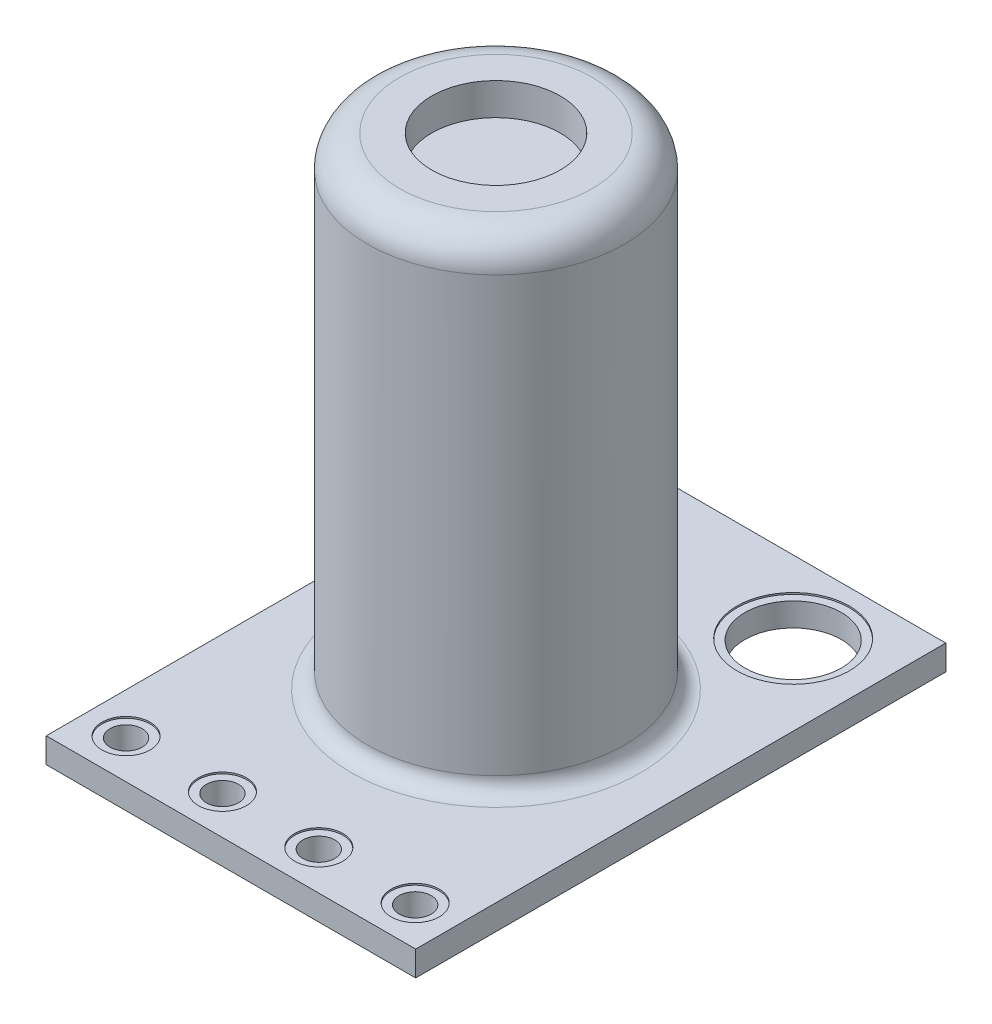
ISO-10303-21;
HEADER;
FILE_DESCRIPTION(('STEP AP214'),'2;1');
FILE_NAME('part.step','',(''),(''),'','','');
FILE_SCHEMA(('AUTOMOTIVE_DESIGN { 1 0 10303 214 1 1 1 1 }'));
ENDSEC;
DATA;
#1=APPLICATION_CONTEXT('core data for automotive mechanical design processes');
#2=APPLICATION_PROTOCOL_DEFINITION('international standard','automotive_design',2000,#1);
#3=PRODUCT_CONTEXT('',#1,'mechanical');
#4=PRODUCT('Part','Part','',(#3));
#5=PRODUCT_RELATED_PRODUCT_CATEGORY('part','',(#4));
#6=PRODUCT_DEFINITION_FORMATION('','',#4);
#7=PRODUCT_DEFINITION_CONTEXT('part definition',#1,'design');
#8=PRODUCT_DEFINITION('design','',#6,#7);
#9=PRODUCT_DEFINITION_SHAPE('','',#8);
#10=(LENGTH_UNIT() NAMED_UNIT(*) SI_UNIT(.MILLI.,.METRE.));
#11=(NAMED_UNIT(*) PLANE_ANGLE_UNIT() SI_UNIT($,.RADIAN.));
#12=(NAMED_UNIT(*) SI_UNIT($,.STERADIAN.) SOLID_ANGLE_UNIT());
#13=UNCERTAINTY_MEASURE_WITH_UNIT(LENGTH_MEASURE(1.E-05),#10,'distance_accuracy_value','');
#14=(GEOMETRIC_REPRESENTATION_CONTEXT(3) GLOBAL_UNCERTAINTY_ASSIGNED_CONTEXT((#13)) GLOBAL_UNIT_ASSIGNED_CONTEXT((#10,
#11,#12)) REPRESENTATION_CONTEXT('',''));
#15=CARTESIAN_POINT('',(0.,0.,0.));
#16=DIRECTION('',(0.,0.,1.));
#17=DIRECTION('',(1.,0.,0.));
#18=AXIS2_PLACEMENT_3D('',#15,#16,#17);
#19=CARTESIAN_POINT('',(-4.5,0.,7.01555949569887));
#20=DIRECTION('',(0.,1.,0.));
#21=DIRECTION('',(0.,0.,1.));
#22=AXIS2_PLACEMENT_3D('',#19,#20,#21);
#23=CYLINDRICAL_SURFACE('',#22,0.500000000000001);
#24=CARTESIAN_POINT('',(-4.5,0.,7.01555949569887));
#25=DIRECTION('',(0.,1.,0.));
#26=DIRECTION('',(0.,0.,1.));
#27=AXIS2_PLACEMENT_3D('',#24,#25,#26);
#28=CIRCLE('',#27,0.500000000000001);
#29=CARTESIAN_POINT('',(-4.5,0.,7.51555949569887));
#30=VERTEX_POINT('',#29);
#31=EDGE_CURVE('E134',#30,#30,#28,.T.);
#32=ORIENTED_EDGE('',*,*,#31,.F.);
#33=EDGE_LOOP('',(#32));
#34=FACE_BOUND('',#33,.T.);
#35=CARTESIAN_POINT('',(-4.5,0.73,7.01555949569887));
#36=DIRECTION('',(0.,1.,0.));
#37=DIRECTION('',(0.,0.,1.));
#38=AXIS2_PLACEMENT_3D('',#35,#36,#37);
#39=CIRCLE('',#38,0.500000000000001);
#40=CARTESIAN_POINT('',(-4.5,0.73,7.51555949569887));
#41=VERTEX_POINT('',#40);
#42=EDGE_CURVE('E268',#41,#41,#39,.T.);
#43=ORIENTED_EDGE('',*,*,#42,.T.);
#44=EDGE_LOOP('',(#43));
#45=FACE_BOUND('',#44,.T.);
#46=ADVANCED_FACE('F57',(#34,#45),#23,.F.);
#47=CARTESIAN_POINT('',(-1.5,0.,7.01555949569887));
#48=DIRECTION('',(0.,1.,0.));
#49=DIRECTION('',(0.,0.,1.));
#50=AXIS2_PLACEMENT_3D('',#47,#48,#49);
#51=CYLINDRICAL_SURFACE('',#50,0.5);
#52=CARTESIAN_POINT('',(-1.5,0.,7.01555949569887));
#53=DIRECTION('',(0.,1.,0.));
#54=DIRECTION('',(0.,0.,1.));
#55=AXIS2_PLACEMENT_3D('',#52,#53,#54);
#56=CIRCLE('',#55,0.5);
#57=CARTESIAN_POINT('',(-1.5,0.,7.51555949569887));
#58=VERTEX_POINT('',#57);
#59=EDGE_CURVE('E231',#58,#58,#56,.T.);
#60=ORIENTED_EDGE('',*,*,#59,.F.);
#61=EDGE_LOOP('',(#60));
#62=FACE_BOUND('',#61,.T.);
#63=CARTESIAN_POINT('',(-1.5,0.73,7.01555949569887));
#64=DIRECTION('',(0.,1.,0.));
#65=DIRECTION('',(0.,0.,1.));
#66=AXIS2_PLACEMENT_3D('',#63,#64,#65);
#67=CIRCLE('',#66,0.5);
#68=CARTESIAN_POINT('',(-1.5,0.73,7.51555949569887));
#69=VERTEX_POINT('',#68);
#70=EDGE_CURVE('E248',#69,#69,#67,.T.);
#71=ORIENTED_EDGE('',*,*,#70,.T.);
#72=EDGE_LOOP('',(#71));
#73=FACE_BOUND('',#72,.T.);
#74=ADVANCED_FACE('F176',(#62,#73),#51,.F.);
#75=CARTESIAN_POINT('',(-3.25,0.,-6.));
#76=DIRECTION('',(0.,1.,0.));
#77=DIRECTION('',(0.,0.,1.));
#78=AXIS2_PLACEMENT_3D('',#75,#76,#77);
#79=CYLINDRICAL_SURFACE('',#78,1.5);
#80=CARTESIAN_POINT('',(-3.25,0.,-6.));
#81=DIRECTION('',(0.,1.,0.));
#82=DIRECTION('',(0.,0.,1.));
#83=AXIS2_PLACEMENT_3D('',#80,#81,#82);
#84=CIRCLE('',#83,1.5);
#85=CARTESIAN_POINT('',(-3.25,0.,-4.5));
#86=VERTEX_POINT('',#85);
#87=EDGE_CURVE('E226',#86,#86,#84,.T.);
#88=CARTESIAN_POINT('',(-3.25,0.73,-6.));
#89=DIRECTION('',(0.,1.,0.));
#90=DIRECTION('',(0.,0.,1.));
#91=AXIS2_PLACEMENT_3D('',#88,#89,#90);
#92=CIRCLE('',#91,1.5);
#93=CARTESIAN_POINT('',(-3.25,0.73,-4.5));
#94=VERTEX_POINT('',#93);
#95=EDGE_CURVE('E324',#94,#94,#92,.T.);
#96=CARTESIAN_POINT('',(-3.25,0.,-4.5));
#97=CARTESIAN_POINT('',(-3.25,0.00760416666666665,-4.5));
#98=CARTESIAN_POINT('',(-3.25,0.0152083333333333,-4.5));
#99=CARTESIAN_POINT('',(-3.25,0.0304166666666667,-4.5));
#100=CARTESIAN_POINT('',(-3.25,0.0380208333333333,-4.5));
#101=CARTESIAN_POINT('',(-3.25,0.0532291666666667,-4.5));
#102=CARTESIAN_POINT('',(-3.25,0.0608333333333333,-4.5));
#103=CARTESIAN_POINT('',(-3.25,0.0760416666666667,-4.5));
#104=CARTESIAN_POINT('',(-3.25,0.0836458333333333,-4.5));
#105=CARTESIAN_POINT('',(-3.25,0.0988541666666666,-4.5));
#106=CARTESIAN_POINT('',(-3.25,0.106458333333333,-4.5));
#107=CARTESIAN_POINT('',(-3.25,0.121666666666667,-4.5));
#108=CARTESIAN_POINT('',(-3.25,0.129270833333333,-4.5));
#109=CARTESIAN_POINT('',(-3.25,0.144479166666667,-4.5));
#110=CARTESIAN_POINT('',(-3.25,0.152083333333333,-4.5));
#111=CARTESIAN_POINT('',(-3.25,0.167291666666667,-4.5));
#112=CARTESIAN_POINT('',(-3.25,0.174895833333333,-4.5));
#113=CARTESIAN_POINT('',(-3.25,0.190104166666667,-4.5));
#114=CARTESIAN_POINT('',(-3.25,0.197708333333333,-4.5));
#115=CARTESIAN_POINT('',(-3.25,0.212916666666667,-4.5));
#116=CARTESIAN_POINT('',(-3.25,0.220520833333333,-4.5));
#117=CARTESIAN_POINT('',(-3.25,0.235729166666667,-4.5));
#118=CARTESIAN_POINT('',(-3.25,0.243333333333333,-4.5));
#119=CARTESIAN_POINT('',(-3.25,0.258541666666667,-4.5));
#120=CARTESIAN_POINT('',(-3.25,0.266145833333333,-4.5));
#121=CARTESIAN_POINT('',(-3.25,0.281354166666667,-4.5));
#122=CARTESIAN_POINT('',(-3.25,0.288958333333333,-4.5));
#123=CARTESIAN_POINT('',(-3.25,0.304166666666667,-4.5));
#124=CARTESIAN_POINT('',(-3.25,0.311770833333333,-4.5));
#125=CARTESIAN_POINT('',(-3.25,0.326979166666667,-4.5));
#126=CARTESIAN_POINT('',(-3.25,0.334583333333333,-4.5));
#127=CARTESIAN_POINT('',(-3.25,0.349791666666667,-4.5));
#128=CARTESIAN_POINT('',(-3.25,0.357395833333333,-4.5));
#129=CARTESIAN_POINT('',(-3.25,0.372604166666667,-4.5));
#130=CARTESIAN_POINT('',(-3.25,0.380208333333333,-4.5));
#131=CARTESIAN_POINT('',(-3.25,0.395416666666667,-4.5));
#132=CARTESIAN_POINT('',(-3.25,0.403020833333333,-4.5));
#133=CARTESIAN_POINT('',(-3.25,0.418229166666667,-4.5));
#134=CARTESIAN_POINT('',(-3.25,0.425833333333333,-4.5));
#135=CARTESIAN_POINT('',(-3.25,0.441041666666667,-4.5));
#136=CARTESIAN_POINT('',(-3.25,0.448645833333333,-4.5));
#137=CARTESIAN_POINT('',(-3.25,0.463854166666667,-4.5));
#138=CARTESIAN_POINT('',(-3.25,0.471458333333333,-4.5));
#139=CARTESIAN_POINT('',(-3.25,0.486666666666667,-4.5));
#140=CARTESIAN_POINT('',(-3.25,0.494270833333333,-4.5));
#141=CARTESIAN_POINT('',(-3.25,0.509479166666667,-4.5));
#142=CARTESIAN_POINT('',(-3.25,0.517083333333333,-4.5));
#143=CARTESIAN_POINT('',(-3.25,0.532291666666667,-4.5));
#144=CARTESIAN_POINT('',(-3.25,0.539895833333333,-4.5));
#145=CARTESIAN_POINT('',(-3.25,0.555104166666667,-4.5));
#146=CARTESIAN_POINT('',(-3.25,0.562708333333333,-4.5));
#147=CARTESIAN_POINT('',(-3.25,0.577916666666667,-4.5));
#148=CARTESIAN_POINT('',(-3.25,0.585520833333333,-4.5));
#149=CARTESIAN_POINT('',(-3.25,0.600729166666667,-4.5));
#150=CARTESIAN_POINT('',(-3.25,0.608333333333333,-4.5));
#151=CARTESIAN_POINT('',(-3.25,0.623541666666667,-4.5));
#152=CARTESIAN_POINT('',(-3.25,0.631145833333333,-4.5));
#153=CARTESIAN_POINT('',(-3.25,0.646354166666666,-4.5));
#154=CARTESIAN_POINT('',(-3.25,0.653958333333333,-4.5));
#155=CARTESIAN_POINT('',(-3.25,0.669166666666667,-4.5));
#156=CARTESIAN_POINT('',(-3.25,0.676770833333333,-4.5));
#157=CARTESIAN_POINT('',(-3.25,0.691979166666666,-4.5));
#158=CARTESIAN_POINT('',(-3.25,0.699583333333333,-4.5));
#159=CARTESIAN_POINT('',(-3.25,0.714791666666666,-4.5));
#160=CARTESIAN_POINT('',(-3.25,0.722395833333333,-4.5));
#161=CARTESIAN_POINT('',(-3.25,0.73,-4.5));
#162=B_SPLINE_CURVE_WITH_KNOTS('',3,(#96,#97,#98,#99,#100,#101,#102,#103,#104,#105,#106,#107,
#108,#109,#110,#111,#112,#113,#114,#115,#116,#117,#118,#119,#120,#121,#122,#123,#124,#125,#126,
#127,#128,#129,#130,#131,#132,#133,#134,#135,#136,#137,#138,#139,#140,#141,#142,#143,#144,#145,
#146,#147,#148,#149,#150,#151,#152,#153,#154,#155,#156,#157,#158,#159,#160,#161),.UNSPECIFIED.,
.F.,.F.,(4,2,2,2,2,2,2,2,2,2,2,2,2,2,2,2,2,2,2,2,2,2,2,2,2,2,2,2,2,2,2,2,4),(0.,0.0228125,
0.045625,0.0684375,0.09125,0.1140625,0.136875,0.1596875,0.1825,0.2053125,0.228125,0.2509375,
0.27375,0.2965625,0.319375,0.3421875,0.365,0.3878125,0.410625,0.4334375,0.45625,0.4790625,
0.501875,0.5246875,0.5475,0.5703125,0.593125,0.6159375,0.63875,0.6615625,0.684375,0.7071875,
0.73),.UNSPECIFIED.);
#163=EDGE_CURVE('BSEAM183',#86,#94,#162,.T.);
#164=ORIENTED_EDGE('',*,*,#87,.F.);
#165=ORIENTED_EDGE('',*,*,#95,.T.);
#166=ORIENTED_EDGE('',*,*,#163,.T.);
#167=ORIENTED_EDGE('',*,*,#163,.F.);
#168=EDGE_LOOP('',(#164,#166,#165,#167));
#169=FACE_BOUND('',#168,.T.);
#170=ADVANCED_FACE('F183',(#169),#79,.F.);
#171=CARTESIAN_POINT('',(0.,0.78,0.));
#172=DIRECTION('',(0.,-1.,0.));
#173=DIRECTION('',(0.,0.,-1.));
#174=AXIS2_PLACEMENT_3D('',#171,#172,#173);
#175=PLANE('',#174);
#176=CARTESIAN_POINT('',(0.,0.78,0.));
#177=DIRECTION('',(0.,-1.,0.));
#178=DIRECTION('',(0.,0.,-1.));
#179=AXIS2_PLACEMENT_3D('',#176,#177,#178);
#180=CIRCLE('',#179,4.5);
#181=CARTESIAN_POINT('',(0.,0.78,-4.5));
#182=VERTEX_POINT('',#181);
#183=EDGE_CURVE('E12',#182,#182,#180,.T.);
#184=ORIENTED_EDGE('',*,*,#183,.T.);
#185=EDGE_LOOP('',(#184));
#186=FACE_BOUND('',#185,.T.);
#187=CARTESIAN_POINT('',(-3.25,0.78,-6.));
#188=DIRECTION('',(0.,1.,0.));
#189=DIRECTION('',(0.,0.,1.));
#190=AXIS2_PLACEMENT_3D('',#187,#188,#189);
#191=CIRCLE('',#190,1.75);
#192=CARTESIAN_POINT('',(-3.25,0.78,-4.25));
#193=VERTEX_POINT('',#192);
#194=EDGE_CURVE('E264',#193,#193,#191,.T.);
#195=ORIENTED_EDGE('',*,*,#194,.F.);
#196=EDGE_LOOP('',(#195));
#197=FACE_BOUND('',#196,.T.);
#198=CARTESIAN_POINT('',(1.5,0.78,7.01555949569887));
#199=DIRECTION('',(0.,1.,0.));
#200=DIRECTION('',(0.,0.,-1.));
#201=AXIS2_PLACEMENT_3D('',#198,#199,#200);
#202=CIRCLE('',#201,0.75);
#203=CARTESIAN_POINT('',(1.5,0.78,6.26555949569887));
#204=VERTEX_POINT('',#203);
#205=EDGE_CURVE('E337',#204,#204,#202,.T.);
#206=ORIENTED_EDGE('',*,*,#205,.F.);
#207=EDGE_LOOP('',(#206));
#208=FACE_BOUND('',#207,.T.);
#209=CARTESIAN_POINT('',(4.5,0.78,7.01555949569887));
#210=DIRECTION('',(0.,1.,0.));
#211=DIRECTION('',(0.,0.,-1.));
#212=AXIS2_PLACEMENT_3D('',#209,#210,#211);
#213=CIRCLE('',#212,0.75);
#214=CARTESIAN_POINT('',(4.5,0.78,6.26555949569887));
#215=VERTEX_POINT('',#214);
#216=EDGE_CURVE('E260',#215,#215,#213,.T.);
#217=ORIENTED_EDGE('',*,*,#216,.F.);
#218=EDGE_LOOP('',(#217));
#219=FACE_BOUND('',#218,.T.);
#220=CARTESIAN_POINT('',(-1.5,0.78,7.01555949569887));
#221=DIRECTION('',(0.,1.,0.));
#222=DIRECTION('',(0.,0.,1.));
#223=AXIS2_PLACEMENT_3D('',#220,#221,#222);
#224=CIRCLE('',#223,0.75);
#225=CARTESIAN_POINT('',(-1.5,0.78,7.76555949569887));
#226=VERTEX_POINT('',#225);
#227=EDGE_CURVE('E251',#226,#226,#224,.T.);
#228=ORIENTED_EDGE('',*,*,#227,.F.);
#229=EDGE_LOOP('',(#228));
#230=FACE_BOUND('',#229,.T.);
#231=CARTESIAN_POINT('',(3.25,0.78,-6.));
#232=DIRECTION('',(0.,1.,0.));
#233=DIRECTION('',(0.,0.,-1.));
#234=AXIS2_PLACEMENT_3D('',#231,#232,#233);
#235=CIRCLE('',#234,1.75);
#236=CARTESIAN_POINT('',(3.25,0.78,-7.75000000000001));
#237=VERTEX_POINT('',#236);
#238=EDGE_CURVE('E334',#237,#237,#235,.T.);
#239=ORIENTED_EDGE('',*,*,#238,.F.);
#240=EDGE_LOOP('',(#239));
#241=FACE_BOUND('',#240,.T.);
#242=CARTESIAN_POINT('',(-4.5,0.78,7.01555949569887));
#243=DIRECTION('',(0.,1.,0.));
#244=DIRECTION('',(0.,0.,1.));
#245=AXIS2_PLACEMENT_3D('',#242,#243,#244);
#246=CIRCLE('',#245,0.75);
#247=CARTESIAN_POINT('',(-4.5,0.78,7.76555949569887));
#248=VERTEX_POINT('',#247);
#249=EDGE_CURVE('E281',#248,#248,#246,.T.);
#250=ORIENTED_EDGE('',*,*,#249,.F.);
#251=EDGE_LOOP('',(#250));
#252=FACE_BOUND('',#251,.T.);
#253=DIRECTION('',(0.,0.,-1.));
#254=VECTOR('',#253,1.);
#255=CARTESIAN_POINT('',(5.75,0.78,8.25));
#256=LINE('',#255,#254);
#257=CARTESIAN_POINT('',(5.75,0.78,8.25));
#258=VERTEX_POINT('',#257);
#259=CARTESIAN_POINT('',(5.75,0.78,-8.25));
#260=VERTEX_POINT('',#259);
#261=EDGE_CURVE('E111',#258,#260,#256,.T.);
#262=ORIENTED_EDGE('',*,*,#261,.T.);
#263=DIRECTION('',(-1.,0.,0.));
#264=VECTOR('',#263,1.);
#265=CARTESIAN_POINT('',(-5.75,0.78,-8.25));
#266=LINE('',#265,#264);
#267=CARTESIAN_POINT('',(-5.75,0.78,-8.25));
#268=VERTEX_POINT('',#267);
#269=EDGE_CURVE('E106',#260,#268,#266,.T.);
#270=ORIENTED_EDGE('',*,*,#269,.T.);
#271=DIRECTION('',(0.,0.,1.));
#272=VECTOR('',#271,1.);
#273=CARTESIAN_POINT('',(-5.75,0.78,8.25));
#274=LINE('',#273,#272);
#275=CARTESIAN_POINT('',(-5.75,0.78,8.25));
#276=VERTEX_POINT('',#275);
#277=EDGE_CURVE('E109',#268,#276,#274,.T.);
#278=ORIENTED_EDGE('',*,*,#277,.T.);
#279=DIRECTION('',(1.,0.,0.));
#280=VECTOR('',#279,1.);
#281=CARTESIAN_POINT('',(-5.75,0.78,8.25));
#282=LINE('',#281,#280);
#283=EDGE_CURVE('E75',#276,#258,#282,.T.);
#284=ORIENTED_EDGE('',*,*,#283,.T.);
#285=EDGE_LOOP('',(#262,#270,#278,#284));
#286=FACE_BOUND('',#285,.T.);
#287=ADVANCED_FACE('F107',(#186,#197,#208,#219,#230,#241,#252,#286),#175,.F.);
#288=CARTESIAN_POINT('',(0.,0.,0.));
#289=DIRECTION('',(0.,-1.,0.));
#290=DIRECTION('',(0.,0.,-1.));
#291=AXIS2_PLACEMENT_3D('',#288,#289,#290);
#292=PLANE('',#291);
#293=ORIENTED_EDGE('',*,*,#87,.T.);
#294=EDGE_LOOP('',(#293));
#295=FACE_BOUND('',#294,.T.);
#296=CARTESIAN_POINT('',(1.5,0.,7.01555949569887));
#297=DIRECTION('',(0.,1.,0.));
#298=DIRECTION('',(0.,0.,1.));
#299=AXIS2_PLACEMENT_3D('',#296,#297,#298);
#300=CIRCLE('',#299,0.5);
#301=CARTESIAN_POINT('',(1.5,0.,7.51555949569887));
#302=VERTEX_POINT('',#301);
#303=EDGE_CURVE('E225',#302,#302,#300,.F.);
#304=ORIENTED_EDGE('',*,*,#303,.F.);
#305=EDGE_LOOP('',(#304));
#306=FACE_BOUND('',#305,.T.);
#307=ORIENTED_EDGE('',*,*,#59,.T.);
#308=EDGE_LOOP('',(#307));
#309=FACE_BOUND('',#308,.T.);
#310=DIRECTION('',(0.,0.,-1.));
#311=VECTOR('',#310,1.);
#312=CARTESIAN_POINT('',(5.75,0.,8.25));
#313=LINE('',#312,#311);
#314=CARTESIAN_POINT('',(5.75,0.,8.25));
#315=VERTEX_POINT('',#314);
#316=CARTESIAN_POINT('',(5.75,0.,-8.25));
#317=VERTEX_POINT('',#316);
#318=EDGE_CURVE('E130',#315,#317,#313,.T.);
#319=ORIENTED_EDGE('',*,*,#318,.F.);
#320=DIRECTION('',(1.,0.,0.));
#321=VECTOR('',#320,1.);
#322=CARTESIAN_POINT('',(-5.75,0.,8.25));
#323=LINE('',#322,#321);
#324=CARTESIAN_POINT('',(-5.75,0.,8.25));
#325=VERTEX_POINT('',#324);
#326=EDGE_CURVE('E98',#325,#315,#323,.T.);
#327=ORIENTED_EDGE('',*,*,#326,.F.);
#328=DIRECTION('',(0.,0.,1.));
#329=VECTOR('',#328,1.);
#330=CARTESIAN_POINT('',(-5.75,0.,8.25));
#331=LINE('',#330,#329);
#332=CARTESIAN_POINT('',(-5.75,0.,-8.25));
#333=VERTEX_POINT('',#332);
#334=EDGE_CURVE('E92',#333,#325,#331,.T.);
#335=ORIENTED_EDGE('',*,*,#334,.F.);
#336=DIRECTION('',(-1.,0.,0.));
#337=VECTOR('',#336,1.);
#338=CARTESIAN_POINT('',(-5.75,0.,-8.25));
#339=LINE('',#338,#337);
#340=EDGE_CURVE('E117',#317,#333,#339,.T.);
#341=ORIENTED_EDGE('',*,*,#340,.F.);
#342=EDGE_LOOP('',(#319,#327,#335,#341));
#343=FACE_BOUND('',#342,.T.);
#344=ORIENTED_EDGE('',*,*,#31,.T.);
#345=EDGE_LOOP('',(#344));
#346=FACE_BOUND('',#345,.T.);
#347=CARTESIAN_POINT('',(3.25,0.,-6.));
#348=DIRECTION('',(0.,1.,0.));
#349=DIRECTION('',(0.,0.,1.));
#350=AXIS2_PLACEMENT_3D('',#347,#348,#349);
#351=CIRCLE('',#350,1.5);
#352=CARTESIAN_POINT('',(3.25,0.,-4.5));
#353=VERTEX_POINT('',#352);
#354=EDGE_CURVE('E219',#353,#353,#351,.F.);
#355=ORIENTED_EDGE('',*,*,#354,.F.);
#356=EDGE_LOOP('',(#355));
#357=FACE_BOUND('',#356,.T.);
#358=CARTESIAN_POINT('',(4.5,0.,7.01555949569887));
#359=DIRECTION('',(0.,1.,0.));
#360=DIRECTION('',(0.,0.,1.));
#361=AXIS2_PLACEMENT_3D('',#358,#359,#360);
#362=CIRCLE('',#361,0.500000000000001);
#363=CARTESIAN_POINT('',(4.5,0.,7.51555949569887));
#364=VERTEX_POINT('',#363);
#365=EDGE_CURVE('E222',#364,#364,#362,.F.);
#366=ORIENTED_EDGE('',*,*,#365,.F.);
#367=EDGE_LOOP('',(#366));
#368=FACE_BOUND('',#367,.T.);
#369=ADVANCED_FACE('F193',(#295,#306,#309,#343,#346,#357,#368),#292,.T.);
#370=CARTESIAN_POINT('',(5.75,0.78,8.25));
#371=DIRECTION('',(-1.,0.,0.));
#372=DIRECTION('',(0.,0.,1.));
#373=AXIS2_PLACEMENT_3D('',#370,#371,#372);
#374=PLANE('',#373);
#375=ORIENTED_EDGE('',*,*,#318,.T.);
#376=DIRECTION('',(0.,-1.,0.));
#377=VECTOR('',#376,1.);
#378=CARTESIAN_POINT('',(5.75,0.78,-8.25));
#379=LINE('',#378,#377);
#380=EDGE_CURVE('E119',#260,#317,#379,.T.);
#381=ORIENTED_EDGE('',*,*,#380,.F.);
#382=ORIENTED_EDGE('',*,*,#261,.F.);
#383=DIRECTION('',(0.,-1.,0.));
#384=VECTOR('',#383,1.);
#385=CARTESIAN_POINT('',(5.75,0.78,8.25));
#386=LINE('',#385,#384);
#387=EDGE_CURVE('E126',#258,#315,#386,.T.);
#388=ORIENTED_EDGE('',*,*,#387,.T.);
#389=EDGE_LOOP('',(#375,#381,#382,#388));
#390=FACE_BOUND('',#389,.T.);
#391=ADVANCED_FACE('F197',(#390),#374,.F.);
#392=CARTESIAN_POINT('',(-5.75,0.78,-8.25));
#393=DIRECTION('',(0.,0.,1.));
#394=DIRECTION('',(1.,0.,0.));
#395=AXIS2_PLACEMENT_3D('',#392,#393,#394);
#396=PLANE('',#395);
#397=ORIENTED_EDGE('',*,*,#340,.T.);
#398=DIRECTION('',(0.,-1.,0.));
#399=VECTOR('',#398,1.);
#400=CARTESIAN_POINT('',(-5.75,0.78,-8.25));
#401=LINE('',#400,#399);
#402=EDGE_CURVE('E115',#268,#333,#401,.T.);
#403=ORIENTED_EDGE('',*,*,#402,.F.);
#404=ORIENTED_EDGE('',*,*,#269,.F.);
#405=ORIENTED_EDGE('',*,*,#380,.T.);
#406=EDGE_LOOP('',(#397,#403,#404,#405));
#407=FACE_BOUND('',#406,.T.);
#408=ADVANCED_FACE('F116',(#407),#396,.F.);
#409=CARTESIAN_POINT('',(-5.75,0.78,8.25));
#410=DIRECTION('',(1.,0.,0.));
#411=DIRECTION('',(0.,0.,-1.));
#412=AXIS2_PLACEMENT_3D('',#409,#410,#411);
#413=PLANE('',#412);
#414=ORIENTED_EDGE('',*,*,#334,.T.);
#415=DIRECTION('',(0.,-1.,0.));
#416=VECTOR('',#415,1.);
#417=CARTESIAN_POINT('',(-5.75,0.78,8.25));
#418=LINE('',#417,#416);
#419=EDGE_CURVE('E120',#276,#325,#418,.T.);
#420=ORIENTED_EDGE('',*,*,#419,.F.);
#421=ORIENTED_EDGE('',*,*,#277,.F.);
#422=ORIENTED_EDGE('',*,*,#402,.T.);
#423=EDGE_LOOP('',(#414,#420,#421,#422));
#424=FACE_BOUND('',#423,.T.);
#425=ADVANCED_FACE('F122',(#424),#413,.F.);
#426=CARTESIAN_POINT('',(-5.75,0.78,8.25));
#427=DIRECTION('',(0.,0.,-1.));
#428=DIRECTION('',(-1.,0.,0.));
#429=AXIS2_PLACEMENT_3D('',#426,#427,#428);
#430=PLANE('',#429);
#431=ORIENTED_EDGE('',*,*,#326,.T.);
#432=ORIENTED_EDGE('',*,*,#387,.F.);
#433=ORIENTED_EDGE('',*,*,#283,.F.);
#434=ORIENTED_EDGE('',*,*,#419,.T.);
#435=EDGE_LOOP('',(#431,#432,#433,#434));
#436=FACE_BOUND('',#435,.T.);
#437=ADVANCED_FACE('F199',(#436),#430,.F.);
#438=CARTESIAN_POINT('',(3.25,0.,-6.));
#439=DIRECTION('',(0.,1.,0.));
#440=DIRECTION('',(0.,0.,1.));
#441=AXIS2_PLACEMENT_3D('',#438,#439,#440);
#442=CYLINDRICAL_SURFACE('',#441,1.5);
#443=CARTESIAN_POINT('',(3.25,0.73,-6.));
#444=DIRECTION('',(0.,1.,0.));
#445=DIRECTION('',(0.,0.,-1.));
#446=AXIS2_PLACEMENT_3D('',#443,#444,#445);
#447=CIRCLE('',#446,1.5);
#448=CARTESIAN_POINT('',(3.25,0.73,-4.5));
#449=VERTEX_POINT('',#448);
#450=EDGE_CURVE('E374',#449,#449,#447,.T.);
#451=CARTESIAN_POINT('',(3.25,0.73,-4.5));
#452=CARTESIAN_POINT('',(3.25,0.722395833333333,-4.5));
#453=CARTESIAN_POINT('',(3.25,0.714791666666666,-4.5));
#454=CARTESIAN_POINT('',(3.25,0.699583333333333,-4.5));
#455=CARTESIAN_POINT('',(3.25,0.691979166666666,-4.5));
#456=CARTESIAN_POINT('',(3.25,0.676770833333333,-4.5));
#457=CARTESIAN_POINT('',(3.25,0.669166666666667,-4.5));
#458=CARTESIAN_POINT('',(3.25,0.653958333333333,-4.5));
#459=CARTESIAN_POINT('',(3.25,0.646354166666666,-4.5));
#460=CARTESIAN_POINT('',(3.25,0.631145833333333,-4.5));
#461=CARTESIAN_POINT('',(3.25,0.623541666666667,-4.5));
#462=CARTESIAN_POINT('',(3.25,0.608333333333333,-4.5));
#463=CARTESIAN_POINT('',(3.25,0.600729166666667,-4.5));
#464=CARTESIAN_POINT('',(3.25,0.585520833333333,-4.5));
#465=CARTESIAN_POINT('',(3.25,0.577916666666666,-4.5));
#466=CARTESIAN_POINT('',(3.25,0.562708333333333,-4.5));
#467=CARTESIAN_POINT('',(3.25,0.555104166666667,-4.5));
#468=CARTESIAN_POINT('',(3.25,0.539895833333333,-4.5));
#469=CARTESIAN_POINT('',(3.25,0.532291666666667,-4.5));
#470=CARTESIAN_POINT('',(3.25,0.517083333333333,-4.5));
#471=CARTESIAN_POINT('',(3.25,0.509479166666667,-4.5));
#472=CARTESIAN_POINT('',(3.25,0.494270833333333,-4.5));
#473=CARTESIAN_POINT('',(3.25,0.486666666666667,-4.5));
#474=CARTESIAN_POINT('',(3.25,0.471458333333333,-4.5));
#475=CARTESIAN_POINT('',(3.25,0.463854166666667,-4.5));
#476=CARTESIAN_POINT('',(3.25,0.448645833333333,-4.5));
#477=CARTESIAN_POINT('',(3.25,0.441041666666667,-4.5));
#478=CARTESIAN_POINT('',(3.25,0.425833333333333,-4.5));
#479=CARTESIAN_POINT('',(3.25,0.418229166666667,-4.5));
#480=CARTESIAN_POINT('',(3.25,0.403020833333333,-4.5));
#481=CARTESIAN_POINT('',(3.25,0.395416666666667,-4.5));
#482=CARTESIAN_POINT('',(3.25,0.380208333333333,-4.5));
#483=CARTESIAN_POINT('',(3.25,0.372604166666667,-4.5));
#484=CARTESIAN_POINT('',(3.25,0.357395833333333,-4.5));
#485=CARTESIAN_POINT('',(3.25,0.349791666666667,-4.5));
#486=CARTESIAN_POINT('',(3.25,0.334583333333333,-4.5));
#487=CARTESIAN_POINT('',(3.25,0.326979166666667,-4.5));
#488=CARTESIAN_POINT('',(3.25,0.311770833333333,-4.5));
#489=CARTESIAN_POINT('',(3.25,0.304166666666667,-4.5));
#490=CARTESIAN_POINT('',(3.25,0.288958333333333,-4.5));
#491=CARTESIAN_POINT('',(3.25,0.281354166666667,-4.5));
#492=CARTESIAN_POINT('',(3.25,0.266145833333333,-4.5));
#493=CARTESIAN_POINT('',(3.25,0.258541666666667,-4.5));
#494=CARTESIAN_POINT('',(3.25,0.243333333333333,-4.5));
#495=CARTESIAN_POINT('',(3.25,0.235729166666667,-4.5));
#496=CARTESIAN_POINT('',(3.25,0.220520833333333,-4.5));
#497=CARTESIAN_POINT('',(3.25,0.212916666666667,-4.5));
#498=CARTESIAN_POINT('',(3.25,0.197708333333333,-4.5));
#499=CARTESIAN_POINT('',(3.25,0.190104166666667,-4.5));
#500=CARTESIAN_POINT('',(3.25,0.174895833333333,-4.5));
#501=CARTESIAN_POINT('',(3.25,0.167291666666667,-4.5));
#502=CARTESIAN_POINT('',(3.25,0.152083333333333,-4.5));
#503=CARTESIAN_POINT('',(3.25,0.144479166666667,-4.5));
#504=CARTESIAN_POINT('',(3.25,0.129270833333333,-4.5));
#505=CARTESIAN_POINT('',(3.25,0.121666666666667,-4.5));
#506=CARTESIAN_POINT('',(3.25,0.106458333333333,-4.5));
#507=CARTESIAN_POINT('',(3.25,0.0988541666666666,-4.5));
#508=CARTESIAN_POINT('',(3.25,0.0836458333333333,-4.5));
#509=CARTESIAN_POINT('',(3.25,0.0760416666666667,-4.5));
#510=CARTESIAN_POINT('',(3.25,0.0608333333333333,-4.5));
#511=CARTESIAN_POINT('',(3.25,0.0532291666666667,-4.5));
#512=CARTESIAN_POINT('',(3.25,0.0380208333333333,-4.5));
#513=CARTESIAN_POINT('',(3.25,0.0304166666666667,-4.5));
#514=CARTESIAN_POINT('',(3.25,0.0152083333333334,-4.5));
#515=CARTESIAN_POINT('',(3.25,0.00760416666666669,-4.5));
#516=CARTESIAN_POINT('',(3.25,0.,-4.5));
#517=B_SPLINE_CURVE_WITH_KNOTS('',3,(#451,#452,#453,#454,#455,#456,#457,#458,#459,#460,#461,
#462,#463,#464,#465,#466,#467,#468,#469,#470,#471,#472,#473,#474,#475,#476,#477,#478,#479,#480,
#481,#482,#483,#484,#485,#486,#487,#488,#489,#490,#491,#492,#493,#494,#495,#496,#497,#498,#499,
#500,#501,#502,#503,#504,#505,#506,#507,#508,#509,#510,#511,#512,#513,#514,#515,#516),
.UNSPECIFIED.,.F.,.F.,(4,2,2,2,2,2,2,2,2,2,2,2,2,2,2,2,2,2,2,2,2,2,2,2,2,2,2,2,2,2,2,2,4),(0.,
0.0228125,0.045625,0.0684375,0.09125,0.1140625,0.136875,0.1596875,0.1825,0.2053125,0.228125,
0.2509375,0.27375,0.2965625,0.319375,0.3421875,0.365,0.3878125,0.410625,0.4334375,0.45625,
0.4790625,0.501875,0.5246875,0.5475,0.5703125,0.593125,0.6159375,0.63875,0.6615625,0.684375,
0.7071875,0.73),.UNSPECIFIED.);
#518=EDGE_CURVE('BSEAM202',#449,#353,#517,.T.);
#519=ORIENTED_EDGE('',*,*,#450,.T.);
#520=ORIENTED_EDGE('',*,*,#354,.T.);
#521=ORIENTED_EDGE('',*,*,#518,.T.);
#522=ORIENTED_EDGE('',*,*,#518,.F.);
#523=EDGE_LOOP('',(#519,#521,#520,#522));
#524=FACE_BOUND('',#523,.T.);
#525=ADVANCED_FACE('F202',(#524),#442,.F.);
#526=CARTESIAN_POINT('',(1.5,0.,7.01555949569887));
#527=DIRECTION('',(0.,1.,0.));
#528=DIRECTION('',(0.,0.,1.));
#529=AXIS2_PLACEMENT_3D('',#526,#527,#528);
#530=CYLINDRICAL_SURFACE('',#529,0.5);
#531=CARTESIAN_POINT('',(1.5,0.73,7.01555949569887));
#532=DIRECTION('',(0.,1.,0.));
#533=DIRECTION('',(0.,0.,-1.));
#534=AXIS2_PLACEMENT_3D('',#531,#532,#533);
#535=CIRCLE('',#534,0.5);
#536=CARTESIAN_POINT('',(1.5,0.73,6.51555949569887));
#537=VERTEX_POINT('',#536);
#538=EDGE_CURVE('E341',#537,#537,#535,.T.);
#539=ORIENTED_EDGE('',*,*,#538,.T.);
#540=EDGE_LOOP('',(#539));
#541=FACE_BOUND('',#540,.T.);
#542=ORIENTED_EDGE('',*,*,#303,.T.);
#543=EDGE_LOOP('',(#542));
#544=FACE_BOUND('',#543,.T.);
#545=ADVANCED_FACE('F190',(#541,#544),#530,.F.);
#546=CARTESIAN_POINT('',(4.5,0.,7.01555949569887));
#547=DIRECTION('',(0.,1.,0.));
#548=DIRECTION('',(0.,0.,1.));
#549=AXIS2_PLACEMENT_3D('',#546,#547,#548);
#550=CYLINDRICAL_SURFACE('',#549,0.500000000000001);
#551=CARTESIAN_POINT('',(4.5,0.73,7.01555949569887));
#552=DIRECTION('',(0.,1.,0.));
#553=DIRECTION('',(0.,0.,-1.));
#554=AXIS2_PLACEMENT_3D('',#551,#552,#553);
#555=CIRCLE('',#554,0.500000000000001);
#556=CARTESIAN_POINT('',(4.5,0.73,6.51555949569887));
#557=VERTEX_POINT('',#556);
#558=EDGE_CURVE('E270',#557,#557,#555,.T.);
#559=ORIENTED_EDGE('',*,*,#558,.T.);
#560=EDGE_LOOP('',(#559));
#561=FACE_BOUND('',#560,.T.);
#562=ORIENTED_EDGE('',*,*,#365,.T.);
#563=EDGE_LOOP('',(#562));
#564=FACE_BOUND('',#563,.T.);
#565=ADVANCED_FACE('F311',(#561,#564),#550,.F.);
#566=CARTESIAN_POINT('',(-3.25,0.73,-6.));
#567=DIRECTION('',(0.,1.,0.));
#568=DIRECTION('',(0.,0.,1.));
#569=AXIS2_PLACEMENT_3D('',#566,#567,#568);
#570=CYLINDRICAL_SURFACE('',#569,1.75);
#571=CARTESIAN_POINT('',(-3.25,0.73,-6.));
#572=DIRECTION('',(0.,1.,0.));
#573=DIRECTION('',(0.,0.,1.));
#574=AXIS2_PLACEMENT_3D('',#571,#572,#573);
#575=CIRCLE('',#574,1.75);
#576=CARTESIAN_POINT('',(-3.25,0.73,-4.25));
#577=VERTEX_POINT('',#576);
#578=EDGE_CURVE('E332',#577,#577,#575,.T.);
#579=ORIENTED_EDGE('',*,*,#578,.F.);
#580=EDGE_LOOP('',(#579));
#581=FACE_BOUND('',#580,.T.);
#582=ORIENTED_EDGE('',*,*,#194,.T.);
#583=EDGE_LOOP('',(#582));
#584=FACE_BOUND('',#583,.T.);
#585=ADVANCED_FACE('F314',(#581,#584),#570,.F.);
#586=CARTESIAN_POINT('',(-3.25,0.73,-6.));
#587=DIRECTION('',(0.,1.,0.));
#588=DIRECTION('',(0.,0.,1.));
#589=AXIS2_PLACEMENT_3D('',#586,#587,#588);
#590=PLANE('',#589);
#591=ORIENTED_EDGE('',*,*,#95,.F.);
#592=EDGE_LOOP('',(#591));
#593=FACE_BOUND('',#592,.T.);
#594=ORIENTED_EDGE('',*,*,#578,.T.);
#595=EDGE_LOOP('',(#594));
#596=FACE_BOUND('',#595,.T.);
#597=ADVANCED_FACE('F409',(#593,#596),#590,.T.);
#598=CARTESIAN_POINT('',(4.5,0.73,7.01555949569887));
#599=DIRECTION('',(0.,1.,0.));
#600=DIRECTION('',(0.,0.,1.));
#601=AXIS2_PLACEMENT_3D('',#598,#599,#600);
#602=CYLINDRICAL_SURFACE('',#601,0.75);
#603=CARTESIAN_POINT('',(4.5,0.73,7.01555949569887));
#604=DIRECTION('',(0.,1.,0.));
#605=DIRECTION('',(0.,0.,-1.));
#606=AXIS2_PLACEMENT_3D('',#603,#604,#605);
#607=CIRCLE('',#606,0.75);
#608=CARTESIAN_POINT('',(4.5,0.73,6.26555949569887));
#609=VERTEX_POINT('',#608);
#610=EDGE_CURVE('E252',#609,#609,#607,.T.);
#611=ORIENTED_EDGE('',*,*,#610,.F.);
#612=EDGE_LOOP('',(#611));
#613=FACE_BOUND('',#612,.T.);
#614=ORIENTED_EDGE('',*,*,#216,.T.);
#615=EDGE_LOOP('',(#614));
#616=FACE_BOUND('',#615,.T.);
#617=ADVANCED_FACE('F412',(#613,#616),#602,.F.);
#618=CARTESIAN_POINT('',(4.5,0.73,7.01555949569887));
#619=DIRECTION('',(0.,-1.,0.));
#620=DIRECTION('',(0.,0.,-1.));
#621=AXIS2_PLACEMENT_3D('',#618,#619,#620);
#622=PLANE('',#621);
#623=ORIENTED_EDGE('',*,*,#558,.F.);
#624=EDGE_LOOP('',(#623));
#625=FACE_BOUND('',#624,.T.);
#626=ORIENTED_EDGE('',*,*,#610,.T.);
#627=EDGE_LOOP('',(#626));
#628=FACE_BOUND('',#627,.T.);
#629=ADVANCED_FACE('F361',(#625,#628),#622,.F.);
#630=CARTESIAN_POINT('',(1.5,0.73,7.01555949569887));
#631=DIRECTION('',(0.,1.,0.));
#632=DIRECTION('',(0.,0.,1.));
#633=AXIS2_PLACEMENT_3D('',#630,#631,#632);
#634=CYLINDRICAL_SURFACE('',#633,0.75);
#635=CARTESIAN_POINT('',(1.5,0.73,7.01555949569887));
#636=DIRECTION('',(0.,1.,0.));
#637=DIRECTION('',(0.,0.,-1.));
#638=AXIS2_PLACEMENT_3D('',#635,#636,#637);
#639=CIRCLE('',#638,0.75);
#640=CARTESIAN_POINT('',(1.5,0.73,6.26555949569887));
#641=VERTEX_POINT('',#640);
#642=EDGE_CURVE('E273',#641,#641,#639,.T.);
#643=ORIENTED_EDGE('',*,*,#642,.F.);
#644=EDGE_LOOP('',(#643));
#645=FACE_BOUND('',#644,.T.);
#646=ORIENTED_EDGE('',*,*,#205,.T.);
#647=EDGE_LOOP('',(#646));
#648=FACE_BOUND('',#647,.T.);
#649=ADVANCED_FACE('F358',(#645,#648),#634,.F.);
#650=CARTESIAN_POINT('',(1.5,0.73,7.01555949569887));
#651=DIRECTION('',(0.,-1.,0.));
#652=DIRECTION('',(0.,0.,-1.));
#653=AXIS2_PLACEMENT_3D('',#650,#651,#652);
#654=PLANE('',#653);
#655=ORIENTED_EDGE('',*,*,#538,.F.);
#656=EDGE_LOOP('',(#655));
#657=FACE_BOUND('',#656,.T.);
#658=ORIENTED_EDGE('',*,*,#642,.T.);
#659=EDGE_LOOP('',(#658));
#660=FACE_BOUND('',#659,.T.);
#661=ADVANCED_FACE('F356',(#657,#660),#654,.F.);
#662=CARTESIAN_POINT('',(-1.5,0.73,7.01555949569887));
#663=DIRECTION('',(0.,1.,0.));
#664=DIRECTION('',(0.,0.,1.));
#665=AXIS2_PLACEMENT_3D('',#662,#663,#664);
#666=CYLINDRICAL_SURFACE('',#665,0.75);
#667=CARTESIAN_POINT('',(-1.5,0.73,7.01555949569887));
#668=DIRECTION('',(0.,1.,0.));
#669=DIRECTION('',(0.,0.,1.));
#670=AXIS2_PLACEMENT_3D('',#667,#668,#669);
#671=CIRCLE('',#670,0.75);
#672=CARTESIAN_POINT('',(-1.5,0.73,7.76555949569887));
#673=VERTEX_POINT('',#672);
#674=EDGE_CURVE('E257',#673,#673,#671,.T.);
#675=ORIENTED_EDGE('',*,*,#674,.F.);
#676=EDGE_LOOP('',(#675));
#677=FACE_BOUND('',#676,.T.);
#678=ORIENTED_EDGE('',*,*,#227,.T.);
#679=EDGE_LOOP('',(#678));
#680=FACE_BOUND('',#679,.T.);
#681=ADVANCED_FACE('F406',(#677,#680),#666,.F.);
#682=CARTESIAN_POINT('',(-1.5,0.73,7.01555949569887));
#683=DIRECTION('',(0.,1.,0.));
#684=DIRECTION('',(0.,0.,1.));
#685=AXIS2_PLACEMENT_3D('',#682,#683,#684);
#686=PLANE('',#685);
#687=ORIENTED_EDGE('',*,*,#70,.F.);
#688=EDGE_LOOP('',(#687));
#689=FACE_BOUND('',#688,.T.);
#690=ORIENTED_EDGE('',*,*,#674,.T.);
#691=EDGE_LOOP('',(#690));
#692=FACE_BOUND('',#691,.T.);
#693=ADVANCED_FACE('F403',(#689,#692),#686,.T.);
#694=CARTESIAN_POINT('',(3.25,0.73,-6.));
#695=DIRECTION('',(0.,1.,0.));
#696=DIRECTION('',(0.,0.,1.));
#697=AXIS2_PLACEMENT_3D('',#694,#695,#696);
#698=CYLINDRICAL_SURFACE('',#697,1.75);
#699=CARTESIAN_POINT('',(3.25,0.73,-6.));
#700=DIRECTION('',(0.,1.,0.));
#701=DIRECTION('',(0.,0.,-1.));
#702=AXIS2_PLACEMENT_3D('',#699,#700,#701);
#703=CIRCLE('',#702,1.75);
#704=CARTESIAN_POINT('',(3.25,0.73,-7.75000000000001));
#705=VERTEX_POINT('',#704);
#706=EDGE_CURVE('E327',#705,#705,#703,.T.);
#707=ORIENTED_EDGE('',*,*,#706,.F.);
#708=EDGE_LOOP('',(#707));
#709=FACE_BOUND('',#708,.T.);
#710=ORIENTED_EDGE('',*,*,#238,.T.);
#711=EDGE_LOOP('',(#710));
#712=FACE_BOUND('',#711,.T.);
#713=ADVANCED_FACE('F302',(#709,#712),#698,.F.);
#714=CARTESIAN_POINT('',(3.25,0.73,-6.));
#715=DIRECTION('',(0.,-1.,0.));
#716=DIRECTION('',(0.,0.,-1.));
#717=AXIS2_PLACEMENT_3D('',#714,#715,#716);
#718=PLANE('',#717);
#719=ORIENTED_EDGE('',*,*,#450,.F.);
#720=EDGE_LOOP('',(#719));
#721=FACE_BOUND('',#720,.T.);
#722=ORIENTED_EDGE('',*,*,#706,.T.);
#723=EDGE_LOOP('',(#722));
#724=FACE_BOUND('',#723,.T.);
#725=ADVANCED_FACE('F293',(#721,#724),#718,.F.);
#726=CARTESIAN_POINT('',(-4.5,0.73,7.01555949569887));
#727=DIRECTION('',(0.,1.,0.));
#728=DIRECTION('',(0.,0.,1.));
#729=AXIS2_PLACEMENT_3D('',#726,#727,#728);
#730=CYLINDRICAL_SURFACE('',#729,0.75);
#731=CARTESIAN_POINT('',(-4.5,0.73,7.01555949569887));
#732=DIRECTION('',(0.,1.,0.));
#733=DIRECTION('',(0.,0.,1.));
#734=AXIS2_PLACEMENT_3D('',#731,#732,#733);
#735=CIRCLE('',#734,0.75);
#736=CARTESIAN_POINT('',(-4.5,0.73,7.76555949569887));
#737=VERTEX_POINT('',#736);
#738=EDGE_CURVE('E282',#737,#737,#735,.T.);
#739=ORIENTED_EDGE('',*,*,#738,.F.);
#740=EDGE_LOOP('',(#739));
#741=FACE_BOUND('',#740,.T.);
#742=ORIENTED_EDGE('',*,*,#249,.T.);
#743=EDGE_LOOP('',(#742));
#744=FACE_BOUND('',#743,.T.);
#745=ADVANCED_FACE('F289',(#741,#744),#730,.F.);
#746=CARTESIAN_POINT('',(-4.5,0.73,7.01555949569887));
#747=DIRECTION('',(0.,1.,0.));
#748=DIRECTION('',(0.,0.,1.));
#749=AXIS2_PLACEMENT_3D('',#746,#747,#748);
#750=PLANE('',#749);
#751=ORIENTED_EDGE('',*,*,#42,.F.);
#752=EDGE_LOOP('',(#751));
#753=FACE_BOUND('',#752,.T.);
#754=ORIENTED_EDGE('',*,*,#738,.T.);
#755=EDGE_LOOP('',(#754));
#756=FACE_BOUND('',#755,.T.);
#757=ADVANCED_FACE('F292',(#753,#756),#750,.T.);
#758=CARTESIAN_POINT('',(0.,15.78,0.));
#759=DIRECTION('',(0.,-1.,0.));
#760=DIRECTION('',(0.,0.,-1.));
#761=AXIS2_PLACEMENT_3D('',#758,#759,#760);
#762=CYLINDRICAL_SURFACE('',#761,4.);
#763=CARTESIAN_POINT('',(0.,1.28,0.));
#764=DIRECTION('',(0.,-1.,0.));
#765=DIRECTION('',(0.,0.,-1.));
#766=AXIS2_PLACEMENT_3D('',#763,#764,#765);
#767=CIRCLE('',#766,4.);
#768=CARTESIAN_POINT('',(0.,1.28,-4.));
#769=VERTEX_POINT('',#768);
#770=EDGE_CURVE('E67',#769,#769,#767,.F.);
#771=ORIENTED_EDGE('',*,*,#770,.T.);
#772=EDGE_LOOP('',(#771));
#773=FACE_BOUND('',#772,.T.);
#774=CARTESIAN_POINT('',(0.,14.78,0.));
#775=DIRECTION('',(0.,1.,0.));
#776=DIRECTION('',(0.,0.,1.));
#777=AXIS2_PLACEMENT_3D('',#774,#775,#776);
#778=CIRCLE('',#777,4.);
#779=CARTESIAN_POINT('',(0.,14.78,4.));
#780=VERTEX_POINT('',#779);
#781=EDGE_CURVE('E151',#780,#780,#778,.F.);
#782=ORIENTED_EDGE('',*,*,#781,.T.);
#783=EDGE_LOOP('',(#782));
#784=FACE_BOUND('',#783,.T.);
#785=ADVANCED_FACE('F158',(#773,#784),#762,.T.);
#786=CARTESIAN_POINT('',(0.,15.78,0.));
#787=DIRECTION('',(0.,1.,0.));
#788=DIRECTION('',(0.,0.,1.));
#789=AXIS2_PLACEMENT_3D('',#786,#787,#788);
#790=PLANE('',#789);
#791=CARTESIAN_POINT('',(0.,15.78,0.));
#792=DIRECTION('',(0.,1.,0.));
#793=DIRECTION('',(0.,0.,1.));
#794=AXIS2_PLACEMENT_3D('',#791,#792,#793);
#795=CIRCLE('',#794,2.);
#796=CARTESIAN_POINT('',(0.,15.78,2.));
#797=VERTEX_POINT('',#796);
#798=EDGE_CURVE('E382',#797,#797,#795,.T.);
#799=ORIENTED_EDGE('',*,*,#798,.F.);
#800=EDGE_LOOP('',(#799));
#801=FACE_BOUND('',#800,.T.);
#802=CARTESIAN_POINT('',(0.,15.78,0.));
#803=DIRECTION('',(0.,1.,0.));
#804=DIRECTION('',(0.,0.,1.));
#805=AXIS2_PLACEMENT_3D('',#802,#803,#804);
#806=CIRCLE('',#805,3.);
#807=CARTESIAN_POINT('',(0.,15.78,3.));
#808=VERTEX_POINT('',#807);
#809=EDGE_CURVE('E147',#808,#808,#806,.T.);
#810=ORIENTED_EDGE('',*,*,#809,.T.);
#811=EDGE_LOOP('',(#810));
#812=FACE_BOUND('',#811,.T.);
#813=ADVANCED_FACE('F172',(#801,#812),#790,.T.);
#814=CARTESIAN_POINT('',(0.,14.78,0.));
#815=DIRECTION('',(0.,1.,0.));
#816=DIRECTION('',(0.,0.,1.));
#817=AXIS2_PLACEMENT_3D('',#814,#815,#816);
#818=TOROIDAL_SURFACE('',#817,3.,1.);
#819=ORIENTED_EDGE('',*,*,#781,.F.);
#820=EDGE_LOOP('',(#819));
#821=FACE_BOUND('',#820,.T.);
#822=ORIENTED_EDGE('',*,*,#809,.F.);
#823=EDGE_LOOP('',(#822));
#824=FACE_BOUND('',#823,.T.);
#825=ADVANCED_FACE('F163',(#821,#824),#818,.T.);
#826=CARTESIAN_POINT('',(0.,1.28,0.));
#827=DIRECTION('',(0.,-1.,0.));
#828=DIRECTION('',(0.,0.,-1.));
#829=AXIS2_PLACEMENT_3D('',#826,#827,#828);
#830=TOROIDAL_SURFACE('',#829,4.5,0.5);
#831=ORIENTED_EDGE('',*,*,#183,.F.);
#832=EDGE_LOOP('',(#831));
#833=FACE_BOUND('',#832,.T.);
#834=ORIENTED_EDGE('',*,*,#770,.F.);
#835=EDGE_LOOP('',(#834));
#836=FACE_BOUND('',#835,.T.);
#837=ADVANCED_FACE('F59',(#833,#836),#830,.F.);
#838=CARTESIAN_POINT('',(0.,14.78,0.));
#839=DIRECTION('',(0.,1.,0.));
#840=DIRECTION('',(0.,0.,1.));
#841=AXIS2_PLACEMENT_3D('',#838,#839,#840);
#842=CYLINDRICAL_SURFACE('',#841,2.);
#843=CARTESIAN_POINT('',(0.,14.78,0.));
#844=DIRECTION('',(0.,1.,0.));
#845=DIRECTION('',(0.,0.,1.));
#846=AXIS2_PLACEMENT_3D('',#843,#844,#845);
#847=CIRCLE('',#846,2.);
#848=CARTESIAN_POINT('',(0.,14.78,2.));
#849=VERTEX_POINT('',#848);
#850=EDGE_CURVE('E377',#849,#849,#847,.T.);
#851=ORIENTED_EDGE('',*,*,#850,.F.);
#852=EDGE_LOOP('',(#851));
#853=FACE_BOUND('',#852,.T.);
#854=ORIENTED_EDGE('',*,*,#798,.T.);
#855=EDGE_LOOP('',(#854));
#856=FACE_BOUND('',#855,.T.);
#857=ADVANCED_FACE('F162',(#853,#856),#842,.F.);
#858=CARTESIAN_POINT('',(0.,14.78,0.));
#859=DIRECTION('',(0.,1.,0.));
#860=DIRECTION('',(0.,0.,1.));
#861=AXIS2_PLACEMENT_3D('',#858,#859,#860);
#862=PLANE('',#861);
#863=ORIENTED_EDGE('',*,*,#850,.T.);
#864=EDGE_LOOP('',(#863));
#865=FACE_BOUND('',#864,.T.);
#866=ADVANCED_FACE('F169',(#865),#862,.T.);
#867=CLOSED_SHELL('',(#46,#74,#170,#287,#369,#391,#408,#425,#437,#525,#545,#565,#585,#597,#617,
#629,#649,#661,#681,#693,#713,#725,#745,#757,#785,#813,#825,#837,#857,#866));
#868=MANIFOLD_SOLID_BREP('B2',#867);
#869=ADVANCED_BREP_SHAPE_REPRESENTATION('',(#18,#868),#14);
#870=SHAPE_DEFINITION_REPRESENTATION(#9,#869);
ENDSEC;
END-ISO-10303-21;
